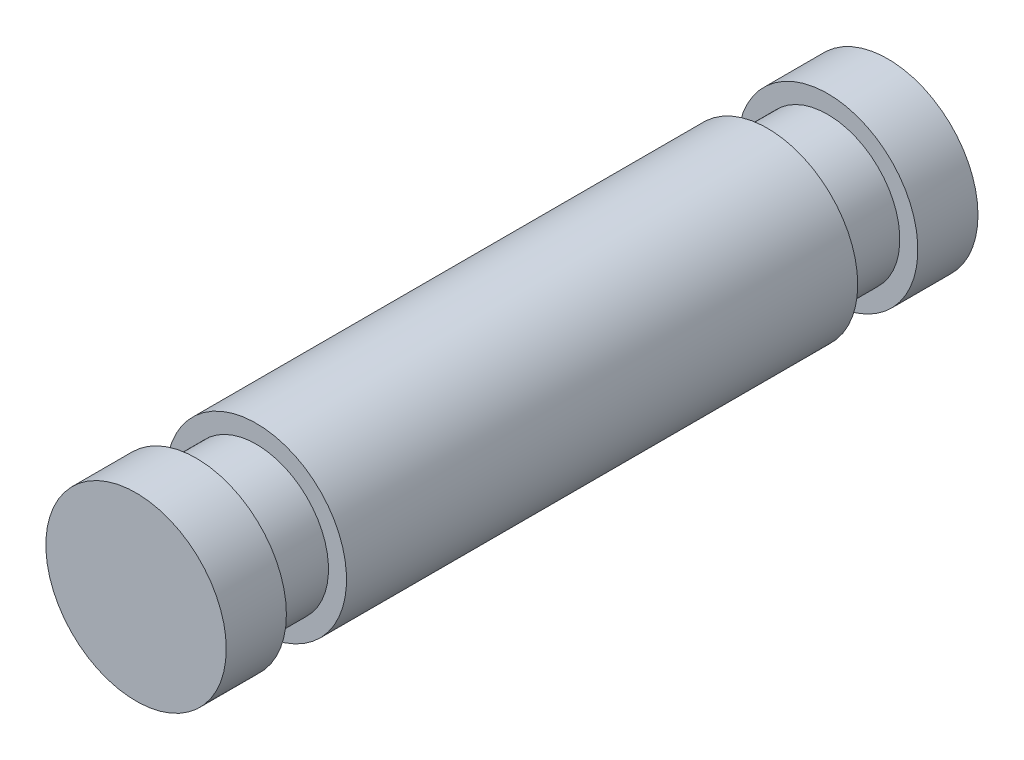
ISO-10303-21;
HEADER;
FILE_DESCRIPTION(('STEP AP214'),'2;1');
FILE_NAME('part.step','',(''),(''),'','','');
FILE_SCHEMA(('AUTOMOTIVE_DESIGN { 1 0 10303 214 1 1 1 1 }'));
ENDSEC;
DATA;
#1=APPLICATION_CONTEXT('core data for automotive mechanical design processes');
#2=APPLICATION_PROTOCOL_DEFINITION('international standard','automotive_design',2000,#1);
#3=PRODUCT_CONTEXT('',#1,'mechanical');
#4=PRODUCT('Part','Part','',(#3));
#5=PRODUCT_RELATED_PRODUCT_CATEGORY('part','',(#4));
#6=PRODUCT_DEFINITION_FORMATION('','',#4);
#7=PRODUCT_DEFINITION_CONTEXT('part definition',#1,'design');
#8=PRODUCT_DEFINITION('design','',#6,#7);
#9=PRODUCT_DEFINITION_SHAPE('','',#8);
#10=(LENGTH_UNIT() NAMED_UNIT(*) SI_UNIT(.MILLI.,.METRE.));
#11=(NAMED_UNIT(*) PLANE_ANGLE_UNIT() SI_UNIT($,.RADIAN.));
#12=(NAMED_UNIT(*) SI_UNIT($,.STERADIAN.) SOLID_ANGLE_UNIT());
#13=UNCERTAINTY_MEASURE_WITH_UNIT(LENGTH_MEASURE(1.E-05),#10,'distance_accuracy_value','');
#14=(GEOMETRIC_REPRESENTATION_CONTEXT(3) GLOBAL_UNCERTAINTY_ASSIGNED_CONTEXT((#13)) GLOBAL_UNIT_ASSIGNED_CONTEXT((#10,
#11,#12)) REPRESENTATION_CONTEXT('',''));
#15=CARTESIAN_POINT('',(0.,0.,0.));
#16=DIRECTION('',(0.,0.,1.));
#17=DIRECTION('',(1.,0.,0.));
#18=AXIS2_PLACEMENT_3D('',#15,#16,#17);
#19=CARTESIAN_POINT('',(0.,0.,12.5));
#20=DIRECTION('',(0.,0.,-1.));
#21=DIRECTION('',(-1.,0.,0.));
#22=AXIS2_PLACEMENT_3D('',#19,#20,#21);
#23=CYLINDRICAL_SURFACE('',#22,1.5);
#24=CARTESIAN_POINT('',(0.,0.,1.));
#25=DIRECTION('',(0.,0.,-1.));
#26=DIRECTION('',(-1.,0.,0.));
#27=AXIS2_PLACEMENT_3D('',#24,#25,#26);
#28=CIRCLE('',#27,1.5);
#29=CARTESIAN_POINT('',(-1.5,0.,1.));
#30=VERTEX_POINT('',#29);
#31=EDGE_CURVE('E52',#30,#30,#28,.T.);
#32=ORIENTED_EDGE('',*,*,#31,.T.);
#33=EDGE_LOOP('',(#32));
#34=FACE_BOUND('',#33,.T.);
#35=CARTESIAN_POINT('',(0.,0.,0.));
#36=DIRECTION('',(0.,0.,1.));
#37=DIRECTION('',(1.,0.,0.));
#38=AXIS2_PLACEMENT_3D('',#35,#36,#37);
#39=CIRCLE('',#38,1.5);
#40=CARTESIAN_POINT('',(1.5,0.,0.));
#41=VERTEX_POINT('',#40);
#42=EDGE_CURVE('E46',#41,#41,#39,.T.);
#43=ORIENTED_EDGE('',*,*,#42,.T.);
#44=EDGE_LOOP('',(#43));
#45=FACE_BOUND('',#44,.T.);
#46=ADVANCED_FACE('F37',(#34,#45),#23,.T.);
#47=CARTESIAN_POINT('',(0.,0.,0.));
#48=DIRECTION('',(0.,0.,1.));
#49=DIRECTION('',(1.,0.,0.));
#50=AXIS2_PLACEMENT_3D('',#47,#48,#49);
#51=PLANE('',#50);
#52=ORIENTED_EDGE('',*,*,#42,.F.);
#53=EDGE_LOOP('',(#52));
#54=FACE_BOUND('',#53,.T.);
#55=ADVANCED_FACE('F115',(#54),#51,.F.);
#56=CARTESIAN_POINT('',(0.,1.2,1.));
#57=DIRECTION('',(0.,0.,-1.));
#58=DIRECTION('',(-1.,0.,0.));
#59=AXIS2_PLACEMENT_3D('',#56,#57,#58);
#60=PLANE('',#59);
#61=CARTESIAN_POINT('',(0.,0.,1.));
#62=DIRECTION('',(0.,0.,-1.));
#63=DIRECTION('',(-1.,0.,0.));
#64=AXIS2_PLACEMENT_3D('',#61,#62,#63);
#65=CIRCLE('',#64,1.2);
#66=CARTESIAN_POINT('',(-1.2,0.,1.));
#67=VERTEX_POINT('',#66);
#68=EDGE_CURVE('E73',#67,#67,#65,.T.);
#69=ORIENTED_EDGE('',*,*,#68,.T.);
#70=EDGE_LOOP('',(#69));
#71=FACE_BOUND('',#70,.T.);
#72=ORIENTED_EDGE('',*,*,#31,.F.);
#73=EDGE_LOOP('',(#72));
#74=FACE_BOUND('',#73,.T.);
#75=ADVANCED_FACE('F95',(#71,#74),#60,.F.);
#76=CARTESIAN_POINT('',(0.,1.2,2.));
#77=DIRECTION('',(0.,0.,1.));
#78=DIRECTION('',(1.,0.,0.));
#79=AXIS2_PLACEMENT_3D('',#76,#77,#78);
#80=PLANE('',#79);
#81=CARTESIAN_POINT('',(0.,0.,2.));
#82=DIRECTION('',(0.,0.,-1.));
#83=DIRECTION('',(-1.,0.,0.));
#84=AXIS2_PLACEMENT_3D('',#81,#82,#83);
#85=CIRCLE('',#84,1.2);
#86=CARTESIAN_POINT('',(-1.2,0.,2.));
#87=VERTEX_POINT('',#86);
#88=EDGE_CURVE('E55',#87,#87,#85,.T.);
#89=ORIENTED_EDGE('',*,*,#88,.F.);
#90=EDGE_LOOP('',(#89));
#91=FACE_BOUND('',#90,.T.);
#92=CARTESIAN_POINT('',(0.,0.,2.));
#93=DIRECTION('',(0.,0.,1.));
#94=DIRECTION('',(1.,0.,0.));
#95=AXIS2_PLACEMENT_3D('',#92,#93,#94);
#96=CIRCLE('',#95,1.5);
#97=CARTESIAN_POINT('',(1.5,0.,2.));
#98=VERTEX_POINT('',#97);
#99=EDGE_CURVE('E58',#98,#98,#96,.T.);
#100=ORIENTED_EDGE('',*,*,#99,.F.);
#101=EDGE_LOOP('',(#100));
#102=FACE_BOUND('',#101,.T.);
#103=ADVANCED_FACE('F92',(#91,#102),#80,.F.);
#104=CARTESIAN_POINT('',(0.,0.,0.));
#105=DIRECTION('',(0.,0.,-1.));
#106=DIRECTION('',(-1.,0.,0.));
#107=AXIS2_PLACEMENT_3D('',#104,#105,#106);
#108=CYLINDRICAL_SURFACE('',#107,1.2);
#109=ORIENTED_EDGE('',*,*,#68,.F.);
#110=EDGE_LOOP('',(#109));
#111=FACE_BOUND('',#110,.T.);
#112=ORIENTED_EDGE('',*,*,#88,.T.);
#113=EDGE_LOOP('',(#112));
#114=FACE_BOUND('',#113,.T.);
#115=ADVANCED_FACE('F90',(#111,#114),#108,.T.);
#116=CARTESIAN_POINT('',(0.,0.,10.5));
#117=DIRECTION('',(0.,0.,-1.));
#118=DIRECTION('',(-1.,0.,0.));
#119=AXIS2_PLACEMENT_3D('',#116,#117,#118);
#120=CIRCLE('',#119,1.5);
#121=CARTESIAN_POINT('',(-1.5,0.,10.5));
#122=VERTEX_POINT('',#121);
#123=EDGE_CURVE('E64',#122,#122,#120,.T.);
#124=ORIENTED_EDGE('',*,*,#123,.T.);
#125=EDGE_LOOP('',(#124));
#126=FACE_BOUND('',#125,.T.);
#127=ORIENTED_EDGE('',*,*,#99,.T.);
#128=EDGE_LOOP('',(#127));
#129=FACE_BOUND('',#128,.T.);
#130=ADVANCED_FACE('F39',(#126,#129),#23,.T.);
#131=CARTESIAN_POINT('',(0.,1.2,11.5));
#132=DIRECTION('',(0.,0.,1.));
#133=DIRECTION('',(-1.,0.,0.));
#134=AXIS2_PLACEMENT_3D('',#131,#132,#133);
#135=PLANE('',#134);
#136=CARTESIAN_POINT('',(0.,0.,11.5));
#137=DIRECTION('',(0.,0.,-1.));
#138=DIRECTION('',(-1.,0.,0.));
#139=AXIS2_PLACEMENT_3D('',#136,#137,#138);
#140=CIRCLE('',#139,1.2);
#141=CARTESIAN_POINT('',(-1.2,0.,11.5));
#142=VERTEX_POINT('',#141);
#143=EDGE_CURVE('E75',#142,#142,#140,.T.);
#144=ORIENTED_EDGE('',*,*,#143,.F.);
#145=EDGE_LOOP('',(#144));
#146=FACE_BOUND('',#145,.T.);
#147=CARTESIAN_POINT('',(0.,0.,11.5));
#148=DIRECTION('',(0.,0.,1.));
#149=DIRECTION('',(1.,0.,0.));
#150=AXIS2_PLACEMENT_3D('',#147,#148,#149);
#151=CIRCLE('',#150,1.5);
#152=CARTESIAN_POINT('',(1.5,0.,11.5));
#153=VERTEX_POINT('',#152);
#154=EDGE_CURVE('E41',#153,#153,#151,.T.);
#155=ORIENTED_EDGE('',*,*,#154,.F.);
#156=EDGE_LOOP('',(#155));
#157=FACE_BOUND('',#156,.T.);
#158=ADVANCED_FACE('F100',(#146,#157),#135,.F.);
#159=CARTESIAN_POINT('',(0.,1.2,10.5));
#160=DIRECTION('',(0.,0.,-1.));
#161=DIRECTION('',(1.,0.,0.));
#162=AXIS2_PLACEMENT_3D('',#159,#160,#161);
#163=PLANE('',#162);
#164=CARTESIAN_POINT('',(0.,0.,10.5));
#165=DIRECTION('',(0.,0.,-1.));
#166=DIRECTION('',(-1.,0.,0.));
#167=AXIS2_PLACEMENT_3D('',#164,#165,#166);
#168=CIRCLE('',#167,1.2);
#169=CARTESIAN_POINT('',(-1.2,0.,10.5));
#170=VERTEX_POINT('',#169);
#171=EDGE_CURVE('E67',#170,#170,#168,.T.);
#172=ORIENTED_EDGE('',*,*,#171,.T.);
#173=EDGE_LOOP('',(#172));
#174=FACE_BOUND('',#173,.T.);
#175=ORIENTED_EDGE('',*,*,#123,.F.);
#176=EDGE_LOOP('',(#175));
#177=FACE_BOUND('',#176,.T.);
#178=ADVANCED_FACE('F106',(#174,#177),#163,.F.);
#179=CARTESIAN_POINT('',(0.,0.,12.5));
#180=DIRECTION('',(0.,0.,1.));
#181=DIRECTION('',(-1.,0.,0.));
#182=AXIS2_PLACEMENT_3D('',#179,#180,#181);
#183=CYLINDRICAL_SURFACE('',#182,1.2);
#184=ORIENTED_EDGE('',*,*,#143,.T.);
#185=EDGE_LOOP('',(#184));
#186=FACE_BOUND('',#185,.T.);
#187=ORIENTED_EDGE('',*,*,#171,.F.);
#188=EDGE_LOOP('',(#187));
#189=FACE_BOUND('',#188,.T.);
#190=ADVANCED_FACE('F131',(#186,#189),#183,.T.);
#191=CARTESIAN_POINT('',(0.,0.,12.5));
#192=DIRECTION('',(0.,0.,1.));
#193=DIRECTION('',(1.,0.,0.));
#194=AXIS2_PLACEMENT_3D('',#191,#192,#193);
#195=PLANE('',#194);
#196=CARTESIAN_POINT('',(0.,0.,12.5));
#197=DIRECTION('',(0.,0.,1.));
#198=DIRECTION('',(1.,0.,0.));
#199=AXIS2_PLACEMENT_3D('',#196,#197,#198);
#200=CIRCLE('',#199,1.5);
#201=CARTESIAN_POINT('',(1.5,0.,12.5));
#202=VERTEX_POINT('',#201);
#203=EDGE_CURVE('E10',#202,#202,#200,.T.);
#204=ORIENTED_EDGE('',*,*,#203,.T.);
#205=EDGE_LOOP('',(#204));
#206=FACE_BOUND('',#205,.T.);
#207=ADVANCED_FACE('F112',(#206),#195,.T.);
#208=ORIENTED_EDGE('',*,*,#154,.T.);
#209=EDGE_LOOP('',(#208));
#210=FACE_BOUND('',#209,.T.);
#211=ORIENTED_EDGE('',*,*,#203,.F.);
#212=EDGE_LOOP('',(#211));
#213=FACE_BOUND('',#212,.T.);
#214=ADVANCED_FACE('F101',(#210,#213),#23,.T.);
#215=CLOSED_SHELL('',(#46,#55,#75,#103,#115,#130,#158,#178,#190,#207,#214));
#216=MANIFOLD_SOLID_BREP('B2',#215);
#217=ADVANCED_BREP_SHAPE_REPRESENTATION('',(#18,#216),#14);
#218=SHAPE_DEFINITION_REPRESENTATION(#9,#217);
ENDSEC;
END-ISO-10303-21;
